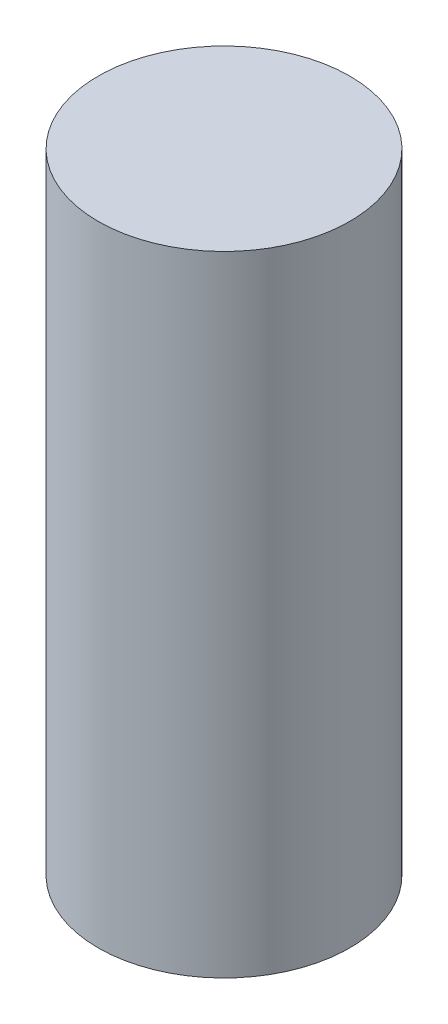
ISO-10303-21;
HEADER;
FILE_DESCRIPTION(('STEP AP214'),'2;1');
FILE_NAME('part.step','',(''),(''),'','','');
FILE_SCHEMA(('AUTOMOTIVE_DESIGN { 1 0 10303 214 1 1 1 1 }'));
ENDSEC;
DATA;
#1=APPLICATION_CONTEXT('core data for automotive mechanical design processes');
#2=APPLICATION_PROTOCOL_DEFINITION('international standard','automotive_design',2000,#1);
#3=PRODUCT_CONTEXT('',#1,'mechanical');
#4=PRODUCT('Part','Part','',(#3));
#5=PRODUCT_RELATED_PRODUCT_CATEGORY('part','',(#4));
#6=PRODUCT_DEFINITION_FORMATION('','',#4);
#7=PRODUCT_DEFINITION_CONTEXT('part definition',#1,'design');
#8=PRODUCT_DEFINITION('design','',#6,#7);
#9=PRODUCT_DEFINITION_SHAPE('','',#8);
#10=(LENGTH_UNIT() NAMED_UNIT(*) SI_UNIT(.MILLI.,.METRE.));
#11=(NAMED_UNIT(*) PLANE_ANGLE_UNIT() SI_UNIT($,.RADIAN.));
#12=(NAMED_UNIT(*) SI_UNIT($,.STERADIAN.) SOLID_ANGLE_UNIT());
#13=UNCERTAINTY_MEASURE_WITH_UNIT(LENGTH_MEASURE(1.E-05),#10,'distance_accuracy_value','');
#14=(GEOMETRIC_REPRESENTATION_CONTEXT(3) GLOBAL_UNCERTAINTY_ASSIGNED_CONTEXT((#13)) GLOBAL_UNIT_ASSIGNED_CONTEXT((#10,
#11,#12)) REPRESENTATION_CONTEXT('',''));
#15=CARTESIAN_POINT('',(0.,0.,0.));
#16=DIRECTION('',(0.,0.,1.));
#17=DIRECTION('',(1.,0.,0.));
#18=AXIS2_PLACEMENT_3D('',#15,#16,#17);
#19=CARTESIAN_POINT('',(0.,150.,0.));
#20=DIRECTION('',(0.,-1.,0.));
#21=DIRECTION('',(0.,0.,-1.));
#22=AXIS2_PLACEMENT_3D('',#19,#20,#21);
#23=CYLINDRICAL_SURFACE('',#22,30.);
#24=CARTESIAN_POINT('',(0.,150.,0.));
#25=DIRECTION('',(0.,1.,0.));
#26=DIRECTION('',(0.,0.,1.));
#27=AXIS2_PLACEMENT_3D('',#24,#25,#26);
#28=CIRCLE('',#27,30.);
#29=CARTESIAN_POINT('',(0.,150.,30.));
#30=VERTEX_POINT('',#29);
#31=EDGE_CURVE('E10',#30,#30,#28,.T.);
#32=ORIENTED_EDGE('',*,*,#31,.F.);
#33=EDGE_LOOP('',(#32));
#34=FACE_BOUND('',#33,.T.);
#35=CARTESIAN_POINT('',(0.,0.,0.));
#36=DIRECTION('',(0.,1.,0.));
#37=DIRECTION('',(0.,0.,1.));
#38=AXIS2_PLACEMENT_3D('',#35,#36,#37);
#39=CIRCLE('',#38,30.);
#40=CARTESIAN_POINT('',(0.,0.,30.));
#41=VERTEX_POINT('',#40);
#42=EDGE_CURVE('E42',#41,#41,#39,.T.);
#43=ORIENTED_EDGE('',*,*,#42,.T.);
#44=EDGE_LOOP('',(#43));
#45=FACE_BOUND('',#44,.T.);
#46=ADVANCED_FACE('F39',(#34,#45),#23,.T.);
#47=CARTESIAN_POINT('',(0.,150.,0.));
#48=DIRECTION('',(0.,1.,0.));
#49=DIRECTION('',(0.,0.,1.));
#50=AXIS2_PLACEMENT_3D('',#47,#48,#49);
#51=PLANE('',#50);
#52=ORIENTED_EDGE('',*,*,#31,.T.);
#53=EDGE_LOOP('',(#52));
#54=FACE_BOUND('',#53,.T.);
#55=ADVANCED_FACE('F58',(#54),#51,.T.);
#56=CARTESIAN_POINT('',(0.,0.,0.));
#57=DIRECTION('',(0.,1.,0.));
#58=DIRECTION('',(0.,0.,1.));
#59=AXIS2_PLACEMENT_3D('',#56,#57,#58);
#60=PLANE('',#59);
#61=ORIENTED_EDGE('',*,*,#42,.F.);
#62=EDGE_LOOP('',(#61));
#63=FACE_BOUND('',#62,.T.);
#64=ADVANCED_FACE('F56',(#63),#60,.F.);
#65=CLOSED_SHELL('',(#46,#55,#64));
#66=MANIFOLD_SOLID_BREP('B2',#65);
#67=ADVANCED_BREP_SHAPE_REPRESENTATION('',(#18,#66),#14);
#68=SHAPE_DEFINITION_REPRESENTATION(#9,#67);
ENDSEC;
END-ISO-10303-21;
